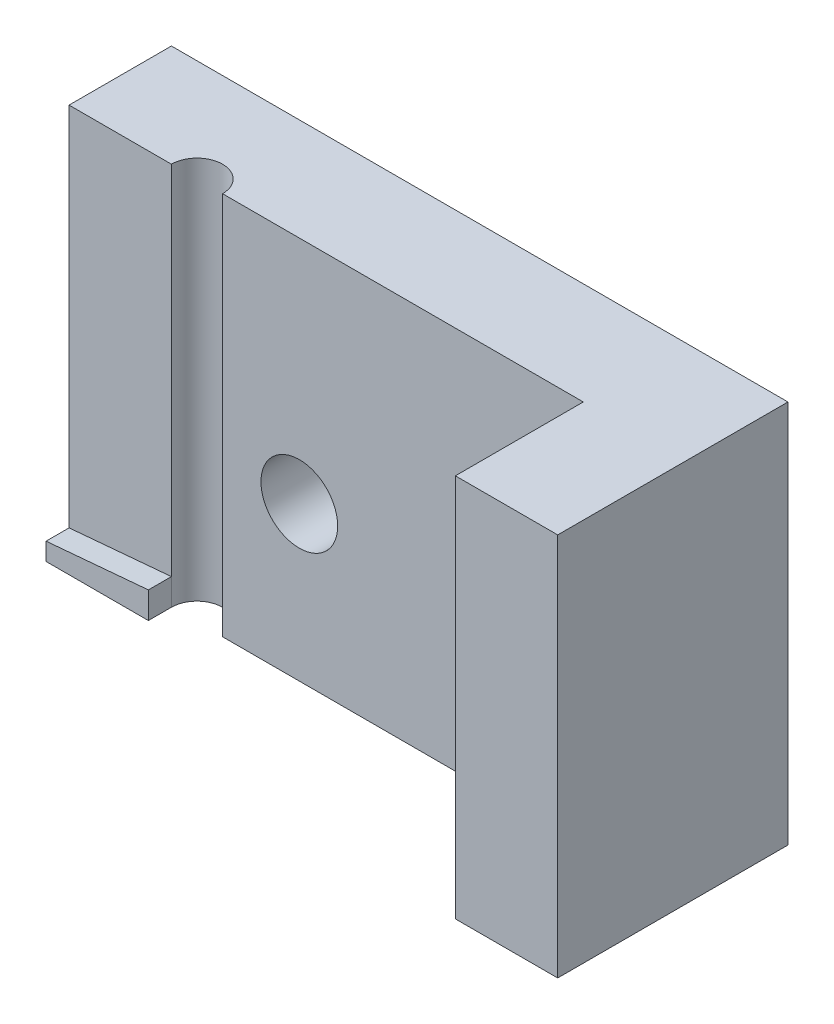
ISO-10303-21;
HEADER;
FILE_DESCRIPTION(('STEP AP214'),'2;1');
FILE_NAME('part.step','',(''),(''),'','','');
FILE_SCHEMA(('AUTOMOTIVE_DESIGN { 1 0 10303 214 1 1 1 1 }'));
ENDSEC;
DATA;
#1=APPLICATION_CONTEXT('core data for automotive mechanical design processes');
#2=APPLICATION_PROTOCOL_DEFINITION('international standard','automotive_design',2000,#1);
#3=PRODUCT_CONTEXT('',#1,'mechanical');
#4=PRODUCT('Part','Part','',(#3));
#5=PRODUCT_RELATED_PRODUCT_CATEGORY('part','',(#4));
#6=PRODUCT_DEFINITION_FORMATION('','',#4);
#7=PRODUCT_DEFINITION_CONTEXT('part definition',#1,'design');
#8=PRODUCT_DEFINITION('design','',#6,#7);
#9=PRODUCT_DEFINITION_SHAPE('','',#8);
#10=(LENGTH_UNIT() NAMED_UNIT(*) SI_UNIT(.MILLI.,.METRE.));
#11=(NAMED_UNIT(*) PLANE_ANGLE_UNIT() SI_UNIT($,.RADIAN.));
#12=(NAMED_UNIT(*) SI_UNIT($,.STERADIAN.) SOLID_ANGLE_UNIT());
#13=UNCERTAINTY_MEASURE_WITH_UNIT(LENGTH_MEASURE(1.E-05),#10,'distance_accuracy_value','');
#14=(GEOMETRIC_REPRESENTATION_CONTEXT(3) GLOBAL_UNCERTAINTY_ASSIGNED_CONTEXT((#13)) GLOBAL_UNIT_ASSIGNED_CONTEXT((#10,
#11,#12)) REPRESENTATION_CONTEXT('',''));
#15=CARTESIAN_POINT('',(0.,0.,0.));
#16=DIRECTION('',(0.,0.,1.));
#17=DIRECTION('',(1.,0.,0.));
#18=AXIS2_PLACEMENT_3D('',#15,#16,#17);
#19=CARTESIAN_POINT('',(0.,0.,0.));
#20=DIRECTION('',(0.,0.,1.));
#21=DIRECTION('',(1.,0.,0.));
#22=AXIS2_PLACEMENT_3D('',#19,#20,#21);
#23=PLANE('',#22);
#24=CARTESIAN_POINT('',(-3.05,-1.5,0.));
#25=DIRECTION('',(0.,0.,1.));
#26=DIRECTION('',(1.,0.,0.));
#27=AXIS2_PLACEMENT_3D('',#24,#25,#26);
#28=CIRCLE('',#27,1.5);
#29=CARTESIAN_POINT('',(-1.55,-1.5,0.));
#30=VERTEX_POINT('',#29);
#31=EDGE_CURVE('E161',#30,#30,#28,.T.);
#32=ORIENTED_EDGE('',*,*,#31,.F.);
#33=EDGE_LOOP('',(#32));
#34=FACE_BOUND('',#33,.T.);
#35=DIRECTION('',(1.,0.,0.));
#36=VECTOR('',#35,1.);
#37=CARTESIAN_POINT('',(-12.05,-7.5,0.));
#38=LINE('',#37,#36);
#39=CARTESIAN_POINT('',(-6.05,-7.5,0.));
#40=VERTEX_POINT('',#39);
#41=CARTESIAN_POINT('',(8.05,-7.5,0.));
#42=VERTEX_POINT('',#41);
#43=EDGE_CURVE('E62',#40,#42,#38,.T.);
#44=ORIENTED_EDGE('',*,*,#43,.T.);
#45=DIRECTION('',(0.,-1.,0.));
#46=VECTOR('',#45,1.);
#47=CARTESIAN_POINT('',(8.05,7.5,0.));
#48=LINE('',#47,#46);
#49=CARTESIAN_POINT('',(8.05,7.5,0.));
#50=VERTEX_POINT('',#49);
#51=EDGE_CURVE('E57',#50,#42,#48,.T.);
#52=ORIENTED_EDGE('',*,*,#51,.F.);
#53=DIRECTION('',(-1.,0.,0.));
#54=VECTOR('',#53,1.);
#55=CARTESIAN_POINT('',(-12.05,7.5,0.));
#56=LINE('',#55,#54);
#57=CARTESIAN_POINT('',(-6.05,7.5,0.));
#58=VERTEX_POINT('',#57);
#59=EDGE_CURVE('E226',#50,#58,#56,.T.);
#60=ORIENTED_EDGE('',*,*,#59,.T.);
#61=DIRECTION('',(0.,-1.,0.));
#62=VECTOR('',#61,1.);
#63=CARTESIAN_POINT('',(-6.05,9.73606797749979,0.));
#64=LINE('',#63,#62);
#65=EDGE_CURVE('E207',#58,#40,#64,.T.);
#66=ORIENTED_EDGE('',*,*,#65,.T.);
#67=EDGE_LOOP('',(#44,#52,#60,#66));
#68=FACE_BOUND('',#67,.T.);
#69=ADVANCED_FACE('F39',(#34,#68),#23,.T.);
#70=DIRECTION('',(0.,-1.,0.));
#71=VECTOR('',#70,1.);
#72=CARTESIAN_POINT('',(-12.05,7.5,0.));
#73=LINE('',#72,#71);
#74=CARTESIAN_POINT('',(-12.05,7.5,0.));
#75=VERTEX_POINT('',#74);
#76=CARTESIAN_POINT('',(-12.05,-6.81211135904999,0.));
#77=VERTEX_POINT('',#76);
#78=EDGE_CURVE('E229',#75,#77,#73,.T.);
#79=ORIENTED_EDGE('',*,*,#78,.T.);
#80=DIRECTION('',(-0.996194698091745,-0.0871557427476612,0.));
#81=VECTOR('',#80,1.);
#82=CARTESIAN_POINT('',(-8.05,-6.46215670494628,0.));
#83=LINE('',#82,#81);
#84=CARTESIAN_POINT('',(-8.05,-6.46215670494628,0.));
#85=VERTEX_POINT('',#84);
#86=EDGE_CURVE('E175',#85,#77,#83,.T.);
#87=ORIENTED_EDGE('',*,*,#86,.F.);
#88=DIRECTION('',(0.,-1.,0.));
#89=VECTOR('',#88,1.);
#90=CARTESIAN_POINT('',(-8.05,9.73606797749979,0.));
#91=LINE('',#90,#89);
#92=CARTESIAN_POINT('',(-8.05,7.5,0.));
#93=VERTEX_POINT('',#92);
#94=EDGE_CURVE('E203',#93,#85,#91,.T.);
#95=ORIENTED_EDGE('',*,*,#94,.F.);
#96=EDGE_CURVE('E213',#93,#75,#56,.T.);
#97=ORIENTED_EDGE('',*,*,#96,.T.);
#98=EDGE_LOOP('',(#79,#87,#95,#97));
#99=FACE_BOUND('',#98,.T.);
#100=ADVANCED_FACE('F247',(#99),#23,.T.);
#101=CARTESIAN_POINT('',(12.05,7.5,-4.));
#102=DIRECTION('',(1.,0.,0.));
#103=DIRECTION('',(0.,1.,0.));
#104=AXIS2_PLACEMENT_3D('',#101,#102,#103);
#105=PLANE('',#104);
#106=DIRECTION('',(0.,0.,1.));
#107=VECTOR('',#106,1.);
#108=CARTESIAN_POINT('',(12.05,7.5,-4.));
#109=LINE('',#108,#107);
#110=CARTESIAN_POINT('',(12.05,7.5,-4.));
#111=VERTEX_POINT('',#110);
#112=CARTESIAN_POINT('',(12.05,7.5,5.));
#113=VERTEX_POINT('',#112);
#114=EDGE_CURVE('E43',#111,#113,#109,.T.);
#115=ORIENTED_EDGE('',*,*,#114,.T.);
#116=DIRECTION('',(0.,1.,0.));
#117=VECTOR('',#116,1.);
#118=CARTESIAN_POINT('',(12.05,7.5,5.));
#119=LINE('',#118,#117);
#120=CARTESIAN_POINT('',(12.05,-7.5,5.));
#121=VERTEX_POINT('',#120);
#122=EDGE_CURVE('E122',#121,#113,#119,.T.);
#123=ORIENTED_EDGE('',*,*,#122,.F.);
#124=DIRECTION('',(0.,0.,1.));
#125=VECTOR('',#124,1.);
#126=CARTESIAN_POINT('',(12.05,-7.5,-4.));
#127=LINE('',#126,#125);
#128=CARTESIAN_POINT('',(12.05,-7.5,-4.));
#129=VERTEX_POINT('',#128);
#130=EDGE_CURVE('E11',#129,#121,#127,.T.);
#131=ORIENTED_EDGE('',*,*,#130,.F.);
#132=DIRECTION('',(0.,1.,0.));
#133=VECTOR('',#132,1.);
#134=CARTESIAN_POINT('',(12.05,7.5,-4.));
#135=LINE('',#134,#133);
#136=EDGE_CURVE('E124',#129,#111,#135,.T.);
#137=ORIENTED_EDGE('',*,*,#136,.T.);
#138=EDGE_LOOP('',(#115,#123,#131,#137));
#139=FACE_BOUND('',#138,.T.);
#140=ADVANCED_FACE('F41',(#139),#105,.T.);
#141=CARTESIAN_POINT('',(-12.05,-7.5,-4.));
#142=DIRECTION('',(0.,-1.,0.));
#143=DIRECTION('',(0.,0.,-1.));
#144=AXIS2_PLACEMENT_3D('',#141,#142,#143);
#145=PLANE('',#144);
#146=CARTESIAN_POINT('',(-7.05,-7.5,0.));
#147=DIRECTION('',(0.,-1.,0.));
#148=DIRECTION('',(0.,0.,1.));
#149=AXIS2_PLACEMENT_3D('',#146,#147,#148);
#150=CIRCLE('',#149,1.);
#151=CARTESIAN_POINT('',(-8.05,-7.5,0.));
#152=VERTEX_POINT('',#151);
#153=EDGE_CURVE('E200',#152,#40,#150,.T.);
#154=ORIENTED_EDGE('',*,*,#153,.F.);
#155=DIRECTION('',(0.,0.,-1.));
#156=VECTOR('',#155,1.);
#157=CARTESIAN_POINT('',(-8.05,-7.5,0.9));
#158=LINE('',#157,#156);
#159=CARTESIAN_POINT('',(-8.05,-7.5,0.9));
#160=VERTEX_POINT('',#159);
#161=EDGE_CURVE('E197',#160,#152,#158,.T.);
#162=ORIENTED_EDGE('',*,*,#161,.F.);
#163=DIRECTION('',(1.,0.,0.));
#164=VECTOR('',#163,1.);
#165=CARTESIAN_POINT('',(-12.05,-7.5,0.9));
#166=LINE('',#165,#164);
#167=CARTESIAN_POINT('',(-12.05,-7.5,0.9));
#168=VERTEX_POINT('',#167);
#169=EDGE_CURVE('E170',#168,#160,#166,.T.);
#170=ORIENTED_EDGE('',*,*,#169,.F.);
#171=DIRECTION('',(0.,0.,1.));
#172=VECTOR('',#171,1.);
#173=CARTESIAN_POINT('',(-12.05,-7.5,-4.));
#174=LINE('',#173,#172);
#175=CARTESIAN_POINT('',(-12.05,-7.5,-4.));
#176=VERTEX_POINT('',#175);
#177=EDGE_CURVE('E49',#176,#168,#174,.T.);
#178=ORIENTED_EDGE('',*,*,#177,.F.);
#179=DIRECTION('',(1.,0.,0.));
#180=VECTOR('',#179,1.);
#181=CARTESIAN_POINT('',(-12.05,-7.5,-4.));
#182=LINE('',#181,#180);
#183=EDGE_CURVE('E130',#176,#129,#182,.T.);
#184=ORIENTED_EDGE('',*,*,#183,.T.);
#185=ORIENTED_EDGE('',*,*,#130,.T.);
#186=DIRECTION('',(1.,0.,0.));
#187=VECTOR('',#186,1.);
#188=CARTESIAN_POINT('',(12.05,-7.5,5.));
#189=LINE('',#188,#187);
#190=CARTESIAN_POINT('',(8.05,-7.5,5.));
#191=VERTEX_POINT('',#190);
#192=EDGE_CURVE('E145',#191,#121,#189,.T.);
#193=ORIENTED_EDGE('',*,*,#192,.F.);
#194=DIRECTION('',(0.,0.,-1.));
#195=VECTOR('',#194,1.);
#196=CARTESIAN_POINT('',(8.05,-7.5,5.));
#197=LINE('',#196,#195);
#198=EDGE_CURVE('E154',#191,#42,#197,.T.);
#199=ORIENTED_EDGE('',*,*,#198,.T.);
#200=ORIENTED_EDGE('',*,*,#43,.F.);
#201=EDGE_LOOP('',(#154,#162,#170,#178,#184,#185,#193,#199,#200));
#202=FACE_BOUND('',#201,.T.);
#203=ADVANCED_FACE('F259',(#202),#145,.T.);
#204=CARTESIAN_POINT('',(-12.05,7.5,-4.));
#205=DIRECTION('',(-1.,0.,0.));
#206=DIRECTION('',(0.,-1.,0.));
#207=AXIS2_PLACEMENT_3D('',#204,#205,#206);
#208=PLANE('',#207);
#209=ORIENTED_EDGE('',*,*,#78,.F.);
#210=DIRECTION('',(0.,0.,1.));
#211=VECTOR('',#210,1.);
#212=CARTESIAN_POINT('',(-12.05,7.5,-4.));
#213=LINE('',#212,#211);
#214=CARTESIAN_POINT('',(-12.05,7.5,-4.));
#215=VERTEX_POINT('',#214);
#216=EDGE_CURVE('E129',#215,#75,#213,.T.);
#217=ORIENTED_EDGE('',*,*,#216,.F.);
#218=DIRECTION('',(0.,-1.,0.));
#219=VECTOR('',#218,1.);
#220=CARTESIAN_POINT('',(-12.05,7.5,-4.));
#221=LINE('',#220,#219);
#222=EDGE_CURVE('E219',#215,#176,#221,.T.);
#223=ORIENTED_EDGE('',*,*,#222,.T.);
#224=ORIENTED_EDGE('',*,*,#177,.T.);
#225=DIRECTION('',(0.,-1.,0.));
#226=VECTOR('',#225,1.);
#227=CARTESIAN_POINT('',(-12.05,-6.81211135904999,0.9));
#228=LINE('',#227,#226);
#229=CARTESIAN_POINT('',(-12.05,-6.81211135904999,0.9));
#230=VERTEX_POINT('',#229);
#231=EDGE_CURVE('E181',#230,#168,#228,.T.);
#232=ORIENTED_EDGE('',*,*,#231,.F.);
#233=DIRECTION('',(0.,0.,-1.));
#234=VECTOR('',#233,1.);
#235=CARTESIAN_POINT('',(-12.05,-6.81211135904999,0.9));
#236=LINE('',#235,#234);
#237=EDGE_CURVE('E185',#230,#77,#236,.T.);
#238=ORIENTED_EDGE('',*,*,#237,.T.);
#239=EDGE_LOOP('',(#209,#217,#223,#224,#232,#238));
#240=FACE_BOUND('',#239,.T.);
#241=ADVANCED_FACE('F242',(#240),#208,.T.);
#242=CARTESIAN_POINT('',(-12.05,7.5,-4.));
#243=DIRECTION('',(0.,1.,0.));
#244=DIRECTION('',(0.,0.,1.));
#245=AXIS2_PLACEMENT_3D('',#242,#243,#244);
#246=PLANE('',#245);
#247=CARTESIAN_POINT('',(-7.05,7.5,0.));
#248=DIRECTION('',(0.,1.,0.));
#249=DIRECTION('',(0.,0.,1.));
#250=AXIS2_PLACEMENT_3D('',#247,#248,#249);
#251=CIRCLE('',#250,1.);
#252=EDGE_CURVE('E204',#93,#58,#251,.F.);
#253=ORIENTED_EDGE('',*,*,#252,.T.);
#254=ORIENTED_EDGE('',*,*,#59,.F.);
#255=DIRECTION('',(0.,0.,-1.));
#256=VECTOR('',#255,1.);
#257=CARTESIAN_POINT('',(8.05,7.5,5.));
#258=LINE('',#257,#256);
#259=CARTESIAN_POINT('',(8.05,7.5,5.));
#260=VERTEX_POINT('',#259);
#261=EDGE_CURVE('E136',#260,#50,#258,.T.);
#262=ORIENTED_EDGE('',*,*,#261,.F.);
#263=DIRECTION('',(-1.,0.,0.));
#264=VECTOR('',#263,1.);
#265=CARTESIAN_POINT('',(12.05,7.5,5.));
#266=LINE('',#265,#264);
#267=EDGE_CURVE('E132',#113,#260,#266,.T.);
#268=ORIENTED_EDGE('',*,*,#267,.F.);
#269=ORIENTED_EDGE('',*,*,#114,.F.);
#270=DIRECTION('',(-1.,0.,0.));
#271=VECTOR('',#270,1.);
#272=CARTESIAN_POINT('',(-12.05,7.5,-4.));
#273=LINE('',#272,#271);
#274=EDGE_CURVE('E216',#111,#215,#273,.T.);
#275=ORIENTED_EDGE('',*,*,#274,.T.);
#276=ORIENTED_EDGE('',*,*,#216,.T.);
#277=ORIENTED_EDGE('',*,*,#96,.F.);
#278=EDGE_LOOP('',(#253,#254,#262,#268,#269,#275,#276,#277));
#279=FACE_BOUND('',#278,.T.);
#280=ADVANCED_FACE('F134',(#279),#246,.T.);
#281=CARTESIAN_POINT('',(0.,0.,-4.));
#282=DIRECTION('',(0.,0.,1.));
#283=DIRECTION('',(1.,0.,0.));
#284=AXIS2_PLACEMENT_3D('',#281,#282,#283);
#285=PLANE('',#284);
#286=CARTESIAN_POINT('',(-3.05,-1.5,-4.));
#287=DIRECTION('',(0.,0.,1.));
#288=DIRECTION('',(1.,0.,0.));
#289=AXIS2_PLACEMENT_3D('',#286,#287,#288);
#290=CIRCLE('',#289,1.5);
#291=CARTESIAN_POINT('',(-1.55,-1.5,-4.));
#292=VERTEX_POINT('',#291);
#293=EDGE_CURVE('E165',#292,#292,#290,.F.);
#294=ORIENTED_EDGE('',*,*,#293,.F.);
#295=EDGE_LOOP('',(#294));
#296=FACE_BOUND('',#295,.T.);
#297=ORIENTED_EDGE('',*,*,#136,.F.);
#298=ORIENTED_EDGE('',*,*,#183,.F.);
#299=ORIENTED_EDGE('',*,*,#222,.F.);
#300=ORIENTED_EDGE('',*,*,#274,.F.);
#301=EDGE_LOOP('',(#297,#298,#299,#300));
#302=FACE_BOUND('',#301,.T.);
#303=ADVANCED_FACE('F262',(#296,#302),#285,.F.);
#304=CARTESIAN_POINT('',(-7.05,9.73606797749979,0.));
#305=DIRECTION('',(0.,-1.,0.));
#306=DIRECTION('',(0.,0.,-1.));
#307=AXIS2_PLACEMENT_3D('',#304,#305,#306);
#308=CYLINDRICAL_SURFACE('',#307,1.);
#309=ORIENTED_EDGE('',*,*,#94,.T.);
#310=DIRECTION('',(0.,1.,0.));
#311=VECTOR('',#310,1.);
#312=CARTESIAN_POINT('',(-8.05,-6.46215670494628,0.));
#313=LINE('',#312,#311);
#314=EDGE_CURVE('E169',#152,#85,#313,.T.);
#315=ORIENTED_EDGE('',*,*,#314,.F.);
#316=ORIENTED_EDGE('',*,*,#153,.T.);
#317=ORIENTED_EDGE('',*,*,#65,.F.);
#318=ORIENTED_EDGE('',*,*,#252,.F.);
#319=EDGE_LOOP('',(#309,#315,#316,#317,#318));
#320=FACE_BOUND('',#319,.T.);
#321=ADVANCED_FACE('F252',(#320),#308,.F.);
#322=CARTESIAN_POINT('',(-8.05,-6.46215670494628,0.9));
#323=DIRECTION('',(-1.,0.,0.));
#324=DIRECTION('',(0.,0.,1.));
#325=AXIS2_PLACEMENT_3D('',#322,#323,#324);
#326=PLANE('',#325);
#327=ORIENTED_EDGE('',*,*,#314,.T.);
#328=DIRECTION('',(0.,0.,-1.));
#329=VECTOR('',#328,1.);
#330=CARTESIAN_POINT('',(-8.05,-6.46215670494628,0.9));
#331=LINE('',#330,#329);
#332=CARTESIAN_POINT('',(-8.05,-6.46215670494628,0.9));
#333=VERTEX_POINT('',#332);
#334=EDGE_CURVE('E193',#333,#85,#331,.T.);
#335=ORIENTED_EDGE('',*,*,#334,.F.);
#336=DIRECTION('',(0.,1.,0.));
#337=VECTOR('',#336,1.);
#338=CARTESIAN_POINT('',(-8.05,-6.46215670494628,0.9));
#339=LINE('',#338,#337);
#340=EDGE_CURVE('E174',#160,#333,#339,.T.);
#341=ORIENTED_EDGE('',*,*,#340,.F.);
#342=ORIENTED_EDGE('',*,*,#161,.T.);
#343=EDGE_LOOP('',(#327,#335,#341,#342));
#344=FACE_BOUND('',#343,.T.);
#345=ADVANCED_FACE('F269',(#344),#326,.F.);
#346=CARTESIAN_POINT('',(-8.05,-6.46215670494628,0.9));
#347=DIRECTION('',(0.0871557427476612,-0.996194698091745,0.));
#348=DIRECTION('',(0.996194698091745,0.0871557427476612,0.));
#349=AXIS2_PLACEMENT_3D('',#346,#347,#348);
#350=PLANE('',#349);
#351=ORIENTED_EDGE('',*,*,#86,.T.);
#352=ORIENTED_EDGE('',*,*,#237,.F.);
#353=DIRECTION('',(-0.996194698091745,-0.0871557427476612,0.));
#354=VECTOR('',#353,1.);
#355=CARTESIAN_POINT('',(-8.05,-6.46215670494628,0.9));
#356=LINE('',#355,#354);
#357=EDGE_CURVE('E178',#333,#230,#356,.T.);
#358=ORIENTED_EDGE('',*,*,#357,.F.);
#359=ORIENTED_EDGE('',*,*,#334,.T.);
#360=EDGE_LOOP('',(#351,#352,#358,#359));
#361=FACE_BOUND('',#360,.T.);
#362=ADVANCED_FACE('F272',(#361),#350,.F.);
#363=CARTESIAN_POINT('',(0.,0.,0.9));
#364=DIRECTION('',(0.,0.,-1.));
#365=DIRECTION('',(-1.,0.,0.));
#366=AXIS2_PLACEMENT_3D('',#363,#364,#365);
#367=PLANE('',#366);
#368=ORIENTED_EDGE('',*,*,#169,.T.);
#369=ORIENTED_EDGE('',*,*,#340,.T.);
#370=ORIENTED_EDGE('',*,*,#357,.T.);
#371=ORIENTED_EDGE('',*,*,#231,.T.);
#372=EDGE_LOOP('',(#368,#369,#370,#371));
#373=FACE_BOUND('',#372,.T.);
#374=ADVANCED_FACE('F265',(#373),#367,.F.);
#375=CARTESIAN_POINT('',(-3.05,-1.5,-8.24264068711929));
#376=DIRECTION('',(0.,0.,1.));
#377=DIRECTION('',(1.,0.,0.));
#378=AXIS2_PLACEMENT_3D('',#375,#376,#377);
#379=CYLINDRICAL_SURFACE('',#378,1.5);
#380=ORIENTED_EDGE('',*,*,#293,.T.);
#381=EDGE_LOOP('',(#380));
#382=FACE_BOUND('',#381,.T.);
#383=ORIENTED_EDGE('',*,*,#31,.T.);
#384=EDGE_LOOP('',(#383));
#385=FACE_BOUND('',#384,.T.);
#386=ADVANCED_FACE('F279',(#382,#385),#379,.F.);
#387=CARTESIAN_POINT('',(8.05,7.5,5.));
#388=DIRECTION('',(1.,0.,0.));
#389=DIRECTION('',(0.,1.,0.));
#390=AXIS2_PLACEMENT_3D('',#387,#388,#389);
#391=PLANE('',#390);
#392=ORIENTED_EDGE('',*,*,#51,.T.);
#393=ORIENTED_EDGE('',*,*,#198,.F.);
#394=DIRECTION('',(0.,-1.,0.));
#395=VECTOR('',#394,1.);
#396=CARTESIAN_POINT('',(8.05,7.5,5.));
#397=LINE('',#396,#395);
#398=EDGE_CURVE('E140',#260,#191,#397,.T.);
#399=ORIENTED_EDGE('',*,*,#398,.F.);
#400=ORIENTED_EDGE('',*,*,#261,.T.);
#401=EDGE_LOOP('',(#392,#393,#399,#400));
#402=FACE_BOUND('',#401,.T.);
#403=ADVANCED_FACE('F256',(#402),#391,.F.);
#404=CARTESIAN_POINT('',(0.,0.,5.));
#405=DIRECTION('',(0.,0.,-1.));
#406=DIRECTION('',(-1.,0.,0.));
#407=AXIS2_PLACEMENT_3D('',#404,#405,#406);
#408=PLANE('',#407);
#409=ORIENTED_EDGE('',*,*,#122,.T.);
#410=ORIENTED_EDGE('',*,*,#267,.T.);
#411=ORIENTED_EDGE('',*,*,#398,.T.);
#412=ORIENTED_EDGE('',*,*,#192,.T.);
#413=EDGE_LOOP('',(#409,#410,#411,#412));
#414=FACE_BOUND('',#413,.T.);
#415=ADVANCED_FACE('F143',(#414),#408,.F.);
#416=CLOSED_SHELL('',(#69,#100,#140,#203,#241,#280,#303,#321,#345,#362,#374,#386,#403,#415));
#417=MANIFOLD_SOLID_BREP('B2',#416);
#418=ADVANCED_BREP_SHAPE_REPRESENTATION('',(#18,#417),#14);
#419=SHAPE_DEFINITION_REPRESENTATION(#9,#418);
ENDSEC;
END-ISO-10303-21;
